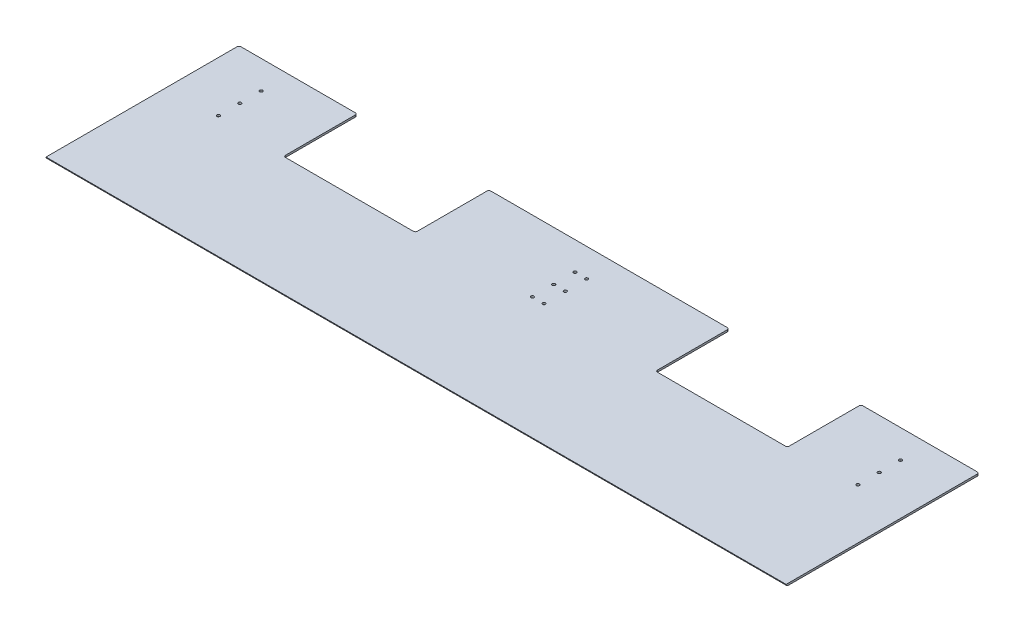
ISO-10303-21;
HEADER;
FILE_DESCRIPTION(('STEP AP214'),'2;1');
FILE_NAME('part.step','',(''),(''),'','','');
FILE_SCHEMA(('AUTOMOTIVE_DESIGN { 1 0 10303 214 1 1 1 1 }'));
ENDSEC;
DATA;
#1=APPLICATION_CONTEXT('core data for automotive mechanical design processes');
#2=APPLICATION_PROTOCOL_DEFINITION('international standard','automotive_design',2000,#1);
#3=PRODUCT_CONTEXT('',#1,'mechanical');
#4=PRODUCT('Part','Part','',(#3));
#5=PRODUCT_RELATED_PRODUCT_CATEGORY('part','',(#4));
#6=PRODUCT_DEFINITION_FORMATION('','',#4);
#7=PRODUCT_DEFINITION_CONTEXT('part definition',#1,'design');
#8=PRODUCT_DEFINITION('design','',#6,#7);
#9=PRODUCT_DEFINITION_SHAPE('','',#8);
#10=(LENGTH_UNIT() NAMED_UNIT(*) SI_UNIT(.MILLI.,.METRE.));
#11=(NAMED_UNIT(*) PLANE_ANGLE_UNIT() SI_UNIT($,.RADIAN.));
#12=(NAMED_UNIT(*) SI_UNIT($,.STERADIAN.) SOLID_ANGLE_UNIT());
#13=UNCERTAINTY_MEASURE_WITH_UNIT(LENGTH_MEASURE(1.E-05),#10,'distance_accuracy_value','');
#14=(GEOMETRIC_REPRESENTATION_CONTEXT(3) GLOBAL_UNCERTAINTY_ASSIGNED_CONTEXT((#13)) GLOBAL_UNIT_ASSIGNED_CONTEXT((#10,
#11,#12)) REPRESENTATION_CONTEXT('',''));
#15=CARTESIAN_POINT('',(0.,0.,0.));
#16=DIRECTION('',(0.,0.,1.));
#17=DIRECTION('',(1.,0.,0.));
#18=AXIS2_PLACEMENT_3D('',#15,#16,#17);
#19=CARTESIAN_POINT('',(0.,3.175,-316.23));
#20=DIRECTION('',(0.,0.,1.));
#21=DIRECTION('',(1.,0.,0.));
#22=AXIS2_PLACEMENT_3D('',#19,#20,#21);
#23=PLANE('',#22);
#24=DIRECTION('',(-1.,0.,0.));
#25=VECTOR('',#24,1.);
#26=CARTESIAN_POINT('',(0.,3.175,-316.23));
#27=LINE('',#26,#25);
#28=CARTESIAN_POINT('',(190.5,3.175,-316.23));
#29=VERTEX_POINT('',#28);
#30=CARTESIAN_POINT('',(3.175,3.175,-316.23));
#31=VERTEX_POINT('',#30);
#32=EDGE_CURVE('E212',#29,#31,#27,.T.);
#33=ORIENTED_EDGE('',*,*,#32,.F.);
#34=DIRECTION('',(0.,1.,0.));
#35=VECTOR('',#34,1.);
#36=CARTESIAN_POINT('',(190.5,3.175,-316.23));
#37=LINE('',#36,#35);
#38=CARTESIAN_POINT('',(190.5,0.,-316.23));
#39=VERTEX_POINT('',#38);
#40=EDGE_CURVE('E55',#29,#39,#37,.F.);
#41=ORIENTED_EDGE('',*,*,#40,.T.);
#42=DIRECTION('',(-1.,0.,0.));
#43=VECTOR('',#42,1.);
#44=CARTESIAN_POINT('',(0.,0.,-316.23));
#45=LINE('',#44,#43);
#46=CARTESIAN_POINT('',(3.175,0.,-316.23));
#47=VERTEX_POINT('',#46);
#48=EDGE_CURVE('E225',#39,#47,#45,.T.);
#49=ORIENTED_EDGE('',*,*,#48,.T.);
#50=DIRECTION('',(0.,-1.,0.));
#51=VECTOR('',#50,1.);
#52=CARTESIAN_POINT('',(3.175,3.175,-316.23));
#53=LINE('',#52,#51);
#54=EDGE_CURVE('E294',#47,#31,#53,.F.);
#55=ORIENTED_EDGE('',*,*,#54,.T.);
#56=EDGE_LOOP('',(#33,#41,#49,#55));
#57=FACE_BOUND('',#56,.T.);
#58=ADVANCED_FACE('F33',(#57),#23,.F.);
#59=CARTESIAN_POINT('',(1209.675,0.,-316.23));
#60=VERTEX_POINT('',#59);
#61=CARTESIAN_POINT('',(1022.35,0.,-316.23));
#62=VERTEX_POINT('',#61);
#63=EDGE_CURVE('E196',#60,#62,#45,.T.);
#64=ORIENTED_EDGE('',*,*,#63,.T.);
#65=DIRECTION('',(0.,1.,0.));
#66=VECTOR('',#65,1.);
#67=CARTESIAN_POINT('',(1022.35,3.175,-316.23));
#68=LINE('',#67,#66);
#69=CARTESIAN_POINT('',(1022.35,3.175,-316.23));
#70=VERTEX_POINT('',#69);
#71=EDGE_CURVE('E284',#62,#70,#68,.T.);
#72=ORIENTED_EDGE('',*,*,#71,.T.);
#73=CARTESIAN_POINT('',(1209.675,3.175,-316.23));
#74=VERTEX_POINT('',#73);
#75=EDGE_CURVE('E216',#74,#70,#27,.T.);
#76=ORIENTED_EDGE('',*,*,#75,.F.);
#77=DIRECTION('',(0.,-1.,0.));
#78=VECTOR('',#77,1.);
#79=CARTESIAN_POINT('',(1209.675,3.175,-316.23));
#80=LINE('',#79,#78);
#81=EDGE_CURVE('E281',#74,#60,#80,.T.);
#82=ORIENTED_EDGE('',*,*,#81,.T.);
#83=EDGE_LOOP('',(#64,#72,#76,#82));
#84=FACE_BOUND('',#83,.T.);
#85=ADVANCED_FACE('F376',(#84),#23,.F.);
#86=CARTESIAN_POINT('',(0.,3.175,0.));
#87=DIRECTION('',(1.,0.,0.));
#88=DIRECTION('',(0.,0.,-1.));
#89=AXIS2_PLACEMENT_3D('',#86,#87,#88);
#90=PLANE('',#89);
#91=DIRECTION('',(0.,0.,1.));
#92=VECTOR('',#91,1.);
#93=CARTESIAN_POINT('',(0.,3.175,0.));
#94=LINE('',#93,#92);
#95=CARTESIAN_POINT('',(0.,3.175,-313.055));
#96=VERTEX_POINT('',#95);
#97=CARTESIAN_POINT('',(0.,3.175,0.));
#98=VERTEX_POINT('',#97);
#99=EDGE_CURVE('E182',#96,#98,#94,.T.);
#100=ORIENTED_EDGE('',*,*,#99,.F.);
#101=DIRECTION('',(0.,-1.,0.));
#102=VECTOR('',#101,1.);
#103=CARTESIAN_POINT('',(0.,3.175,-313.055));
#104=LINE('',#103,#102);
#105=CARTESIAN_POINT('',(0.,0.,-313.055));
#106=VERTEX_POINT('',#105);
#107=EDGE_CURVE('E297',#96,#106,#104,.T.);
#108=ORIENTED_EDGE('',*,*,#107,.T.);
#109=DIRECTION('',(0.,0.,1.));
#110=VECTOR('',#109,1.);
#111=CARTESIAN_POINT('',(0.,0.,0.));
#112=LINE('',#111,#110);
#113=CARTESIAN_POINT('',(0.,0.,-3.175));
#114=VERTEX_POINT('',#113);
#115=EDGE_CURVE('E201',#106,#114,#112,.T.);
#116=ORIENTED_EDGE('',*,*,#115,.T.);
#117=CARTESIAN_POINT('',(0.,3.175,-3.175));
#118=DIRECTION('',(1.,0.,0.));
#119=DIRECTION('',(0.,0.,-1.));
#120=AXIS2_PLACEMENT_3D('',#117,#118,#119);
#121=CIRCLE('',#120,3.175);
#122=EDGE_CURVE('E199',#114,#98,#121,.F.);
#123=ORIENTED_EDGE('',*,*,#122,.T.);
#124=EDGE_LOOP('',(#100,#108,#116,#123));
#125=FACE_BOUND('',#124,.T.);
#126=ADVANCED_FACE('F200',(#125),#90,.F.);
#127=CARTESIAN_POINT('',(1212.85,3.175,0.));
#128=DIRECTION('',(-1.,0.,0.));
#129=DIRECTION('',(0.,0.,1.));
#130=AXIS2_PLACEMENT_3D('',#127,#128,#129);
#131=PLANE('',#130);
#132=DIRECTION('',(0.,0.,-1.));
#133=VECTOR('',#132,1.);
#134=CARTESIAN_POINT('',(1212.85,0.,0.));
#135=LINE('',#134,#133);
#136=CARTESIAN_POINT('',(1212.85,0.,-3.175));
#137=VERTEX_POINT('',#136);
#138=CARTESIAN_POINT('',(1212.85,0.,-313.055));
#139=VERTEX_POINT('',#138);
#140=EDGE_CURVE('E221',#137,#139,#135,.T.);
#141=ORIENTED_EDGE('',*,*,#140,.T.);
#142=DIRECTION('',(0.,-1.,0.));
#143=VECTOR('',#142,1.);
#144=CARTESIAN_POINT('',(1212.85,3.175,-313.055));
#145=LINE('',#144,#143);
#146=CARTESIAN_POINT('',(1212.85,3.175,-313.055));
#147=VERTEX_POINT('',#146);
#148=EDGE_CURVE('E287',#139,#147,#145,.F.);
#149=ORIENTED_EDGE('',*,*,#148,.T.);
#150=DIRECTION('',(0.,0.,-1.));
#151=VECTOR('',#150,1.);
#152=CARTESIAN_POINT('',(1212.85,3.175,0.));
#153=LINE('',#152,#151);
#154=CARTESIAN_POINT('',(1212.85,3.175,0.));
#155=VERTEX_POINT('',#154);
#156=EDGE_CURVE('E210',#155,#147,#153,.T.);
#157=ORIENTED_EDGE('',*,*,#156,.F.);
#158=CARTESIAN_POINT('',(1212.85,3.175,-3.175));
#159=DIRECTION('',(-1.,0.,0.));
#160=DIRECTION('',(0.,0.,1.));
#161=AXIS2_PLACEMENT_3D('',#158,#159,#160);
#162=CIRCLE('',#161,3.175);
#163=EDGE_CURVE('E209',#155,#137,#162,.F.);
#164=ORIENTED_EDGE('',*,*,#163,.T.);
#165=EDGE_LOOP('',(#141,#149,#157,#164));
#166=FACE_BOUND('',#165,.T.);
#167=ADVANCED_FACE('F416',(#166),#131,.F.);
#168=CARTESIAN_POINT('',(800.1,0.,-316.23));
#169=VERTEX_POINT('',#168);
#170=CARTESIAN_POINT('',(412.75,0.,-316.23));
#171=VERTEX_POINT('',#170);
#172=EDGE_CURVE('E227',#169,#171,#45,.T.);
#173=ORIENTED_EDGE('',*,*,#172,.T.);
#174=DIRECTION('',(0.,1.,0.));
#175=VECTOR('',#174,1.);
#176=CARTESIAN_POINT('',(412.75,3.175,-316.23));
#177=LINE('',#176,#175);
#178=CARTESIAN_POINT('',(412.75,3.175,-316.23));
#179=VERTEX_POINT('',#178);
#180=EDGE_CURVE('E241',#171,#179,#177,.T.);
#181=ORIENTED_EDGE('',*,*,#180,.T.);
#182=CARTESIAN_POINT('',(800.1,3.175,-316.23));
#183=VERTEX_POINT('',#182);
#184=EDGE_CURVE('E219',#183,#179,#27,.T.);
#185=ORIENTED_EDGE('',*,*,#184,.F.);
#186=DIRECTION('',(0.,1.,0.));
#187=VECTOR('',#186,1.);
#188=CARTESIAN_POINT('',(800.1,3.175,-316.23));
#189=LINE('',#188,#187);
#190=EDGE_CURVE('E239',#183,#169,#189,.F.);
#191=ORIENTED_EDGE('',*,*,#190,.T.);
#192=EDGE_LOOP('',(#173,#181,#185,#191));
#193=FACE_BOUND('',#192,.T.);
#194=ADVANCED_FACE('F383',(#193),#23,.F.);
#195=CARTESIAN_POINT('',(0.,3.175,0.));
#196=DIRECTION('',(0.,-1.,0.));
#197=DIRECTION('',(0.,0.,-1.));
#198=AXIS2_PLACEMENT_3D('',#195,#196,#197);
#199=PLANE('',#198);
#200=CARTESIAN_POINT('',(82.55,3.175,-200.1012));
#201=DIRECTION('',(0.,1.,0.));
#202=DIRECTION('',(0.,0.,1.));
#203=AXIS2_PLACEMENT_3D('',#200,#201,#202);
#204=CIRCLE('',#203,2.45744999999999);
#205=CARTESIAN_POINT('',(82.55,3.175,-197.64375));
#206=VERTEX_POINT('',#205);
#207=EDGE_CURVE('E506',#206,#206,#204,.T.);
#208=ORIENTED_EDGE('',*,*,#207,.F.);
#209=EDGE_LOOP('',(#208));
#210=FACE_BOUND('',#209,.T.);
#211=CARTESIAN_POINT('',(82.55,3.175,-235.0262));
#212=DIRECTION('',(0.,1.,0.));
#213=DIRECTION('',(0.,0.,1.));
#214=AXIS2_PLACEMENT_3D('',#211,#212,#213);
#215=CIRCLE('',#214,2.45744999999999);
#216=CARTESIAN_POINT('',(82.55,3.175,-232.56875));
#217=VERTEX_POINT('',#216);
#218=EDGE_CURVE('E508',#217,#217,#215,.T.);
#219=ORIENTED_EDGE('',*,*,#218,.F.);
#220=EDGE_LOOP('',(#219));
#221=FACE_BOUND('',#220,.T.);
#222=CARTESIAN_POINT('',(82.55,3.175,-269.9512));
#223=DIRECTION('',(0.,1.,0.));
#224=DIRECTION('',(0.,0.,1.));
#225=AXIS2_PLACEMENT_3D('',#222,#223,#224);
#226=CIRCLE('',#225,2.45744999999999);
#227=CARTESIAN_POINT('',(82.55,3.175,-267.49375));
#228=VERTEX_POINT('',#227);
#229=EDGE_CURVE('E516',#228,#228,#226,.T.);
#230=ORIENTED_EDGE('',*,*,#229,.F.);
#231=EDGE_LOOP('',(#230));
#232=FACE_BOUND('',#231,.T.);
#233=CARTESIAN_POINT('',(596.9,3.175,-200.1012));
#234=DIRECTION('',(0.,1.,0.));
#235=DIRECTION('',(0.,0.,1.));
#236=AXIS2_PLACEMENT_3D('',#233,#234,#235);
#237=CIRCLE('',#236,2.45744999999997);
#238=CARTESIAN_POINT('',(596.9,3.175,-197.64375));
#239=VERTEX_POINT('',#238);
#240=EDGE_CURVE('E522',#239,#239,#237,.T.);
#241=ORIENTED_EDGE('',*,*,#240,.F.);
#242=EDGE_LOOP('',(#241));
#243=FACE_BOUND('',#242,.T.);
#244=CARTESIAN_POINT('',(596.9,3.175,-235.0262));
#245=DIRECTION('',(0.,1.,0.));
#246=DIRECTION('',(0.,0.,1.));
#247=AXIS2_PLACEMENT_3D('',#244,#245,#246);
#248=CIRCLE('',#247,2.45744999999997);
#249=CARTESIAN_POINT('',(596.9,3.175,-232.56875));
#250=VERTEX_POINT('',#249);
#251=EDGE_CURVE('E528',#250,#250,#248,.T.);
#252=ORIENTED_EDGE('',*,*,#251,.F.);
#253=EDGE_LOOP('',(#252));
#254=FACE_BOUND('',#253,.T.);
#255=CARTESIAN_POINT('',(596.9,3.175,-269.9512));
#256=DIRECTION('',(0.,1.,0.));
#257=DIRECTION('',(0.,0.,1.));
#258=AXIS2_PLACEMENT_3D('',#255,#256,#257);
#259=CIRCLE('',#258,2.45744999999997);
#260=CARTESIAN_POINT('',(596.9,3.175,-267.49375));
#261=VERTEX_POINT('',#260);
#262=EDGE_CURVE('E534',#261,#261,#259,.T.);
#263=ORIENTED_EDGE('',*,*,#262,.F.);
#264=EDGE_LOOP('',(#263));
#265=FACE_BOUND('',#264,.T.);
#266=CARTESIAN_POINT('',(615.95,3.175,-269.9512));
#267=DIRECTION('',(0.,1.,0.));
#268=DIRECTION('',(0.,0.,1.));
#269=AXIS2_PLACEMENT_3D('',#266,#267,#268);
#270=CIRCLE('',#269,2.45744999999997);
#271=CARTESIAN_POINT('',(615.95,3.175,-267.49375));
#272=VERTEX_POINT('',#271);
#273=EDGE_CURVE('E540',#272,#272,#270,.T.);
#274=ORIENTED_EDGE('',*,*,#273,.F.);
#275=EDGE_LOOP('',(#274));
#276=FACE_BOUND('',#275,.T.);
#277=CARTESIAN_POINT('',(615.95,3.175,-235.0262));
#278=DIRECTION('',(0.,1.,0.));
#279=DIRECTION('',(0.,0.,1.));
#280=AXIS2_PLACEMENT_3D('',#277,#278,#279);
#281=CIRCLE('',#280,2.45744999999997);
#282=CARTESIAN_POINT('',(615.95,3.175,-232.56875));
#283=VERTEX_POINT('',#282);
#284=EDGE_CURVE('E546',#283,#283,#281,.T.);
#285=ORIENTED_EDGE('',*,*,#284,.F.);
#286=EDGE_LOOP('',(#285));
#287=FACE_BOUND('',#286,.T.);
#288=CARTESIAN_POINT('',(615.95,3.175,-200.1012));
#289=DIRECTION('',(0.,1.,0.));
#290=DIRECTION('',(0.,0.,1.));
#291=AXIS2_PLACEMENT_3D('',#288,#289,#290);
#292=CIRCLE('',#291,2.45744999999997);
#293=CARTESIAN_POINT('',(615.95,3.175,-197.64375));
#294=VERTEX_POINT('',#293);
#295=EDGE_CURVE('E552',#294,#294,#292,.T.);
#296=ORIENTED_EDGE('',*,*,#295,.F.);
#297=EDGE_LOOP('',(#296));
#298=FACE_BOUND('',#297,.T.);
#299=CARTESIAN_POINT('',(1130.3,3.175,-269.9512));
#300=DIRECTION('',(0.,1.,0.));
#301=DIRECTION('',(0.,0.,1.));
#302=AXIS2_PLACEMENT_3D('',#299,#300,#301);
#303=CIRCLE('',#302,2.45745000000008);
#304=CARTESIAN_POINT('',(1130.3,3.175,-267.49375));
#305=VERTEX_POINT('',#304);
#306=EDGE_CURVE('E558',#305,#305,#303,.T.);
#307=ORIENTED_EDGE('',*,*,#306,.F.);
#308=EDGE_LOOP('',(#307));
#309=FACE_BOUND('',#308,.T.);
#310=CARTESIAN_POINT('',(1130.3,3.175,-235.0262));
#311=DIRECTION('',(0.,1.,0.));
#312=DIRECTION('',(0.,0.,1.));
#313=AXIS2_PLACEMENT_3D('',#310,#311,#312);
#314=CIRCLE('',#313,2.45745000000008);
#315=CARTESIAN_POINT('',(1130.3,3.175,-232.56875));
#316=VERTEX_POINT('',#315);
#317=EDGE_CURVE('E564',#316,#316,#314,.T.);
#318=ORIENTED_EDGE('',*,*,#317,.F.);
#319=EDGE_LOOP('',(#318));
#320=FACE_BOUND('',#319,.T.);
#321=CARTESIAN_POINT('',(1130.3,3.175,-200.1012));
#322=DIRECTION('',(0.,1.,0.));
#323=DIRECTION('',(0.,0.,1.));
#324=AXIS2_PLACEMENT_3D('',#321,#322,#323);
#325=CIRCLE('',#324,2.45745000000008);
#326=CARTESIAN_POINT('',(1130.3,3.175,-197.64375));
#327=VERTEX_POINT('',#326);
#328=EDGE_CURVE('E570',#327,#327,#325,.T.);
#329=ORIENTED_EDGE('',*,*,#328,.F.);
#330=EDGE_LOOP('',(#329));
#331=FACE_BOUND('',#330,.T.);
#332=ORIENTED_EDGE('',*,*,#184,.T.);
#333=CARTESIAN_POINT('',(412.75,3.175,-313.055));
#334=DIRECTION('',(0.,-1.,0.));
#335=DIRECTION('',(0.,0.,-1.));
#336=AXIS2_PLACEMENT_3D('',#333,#334,#335);
#337=CIRCLE('',#336,3.175);
#338=CARTESIAN_POINT('',(409.575,3.175,-313.055));
#339=VERTEX_POINT('',#338);
#340=EDGE_CURVE('E253',#179,#339,#337,.F.);
#341=ORIENTED_EDGE('',*,*,#340,.T.);
#342=DIRECTION('',(0.,0.,-1.));
#343=VECTOR('',#342,1.);
#344=CARTESIAN_POINT('',(409.575,3.175,-316.23));
#345=LINE('',#344,#343);
#346=CARTESIAN_POINT('',(409.575,3.175,-198.755));
#347=VERTEX_POINT('',#346);
#348=EDGE_CURVE('E340',#347,#339,#345,.T.);
#349=ORIENTED_EDGE('',*,*,#348,.F.);
#350=CARTESIAN_POINT('',(406.4,3.175,-198.755));
#351=DIRECTION('',(0.,-1.,0.));
#352=DIRECTION('',(0.,0.,-1.));
#353=AXIS2_PLACEMENT_3D('',#350,#351,#352);
#354=CIRCLE('',#353,3.175);
#355=CARTESIAN_POINT('',(406.4,3.175,-195.58));
#356=VERTEX_POINT('',#355);
#357=EDGE_CURVE('E299',#347,#356,#354,.T.);
#358=ORIENTED_EDGE('',*,*,#357,.T.);
#359=DIRECTION('',(1.,0.,0.));
#360=VECTOR('',#359,1.);
#361=CARTESIAN_POINT('',(193.675,3.175,-195.58));
#362=LINE('',#361,#360);
#363=CARTESIAN_POINT('',(196.85,3.175,-195.58));
#364=VERTEX_POINT('',#363);
#365=EDGE_CURVE('E315',#364,#356,#362,.T.);
#366=ORIENTED_EDGE('',*,*,#365,.F.);
#367=CARTESIAN_POINT('',(196.85,3.175,-198.755));
#368=DIRECTION('',(0.,-1.,0.));
#369=DIRECTION('',(0.,0.,-1.));
#370=AXIS2_PLACEMENT_3D('',#367,#368,#369);
#371=CIRCLE('',#370,3.175);
#372=CARTESIAN_POINT('',(193.675,3.175,-198.755));
#373=VERTEX_POINT('',#372);
#374=EDGE_CURVE('E41',#364,#373,#371,.T.);
#375=ORIENTED_EDGE('',*,*,#374,.T.);
#376=DIRECTION('',(0.,0.,1.));
#377=VECTOR('',#376,1.);
#378=CARTESIAN_POINT('',(193.675,3.175,-316.23));
#379=LINE('',#378,#377);
#380=CARTESIAN_POINT('',(193.675,3.175,-313.055));
#381=VERTEX_POINT('',#380);
#382=EDGE_CURVE('E313',#381,#373,#379,.T.);
#383=ORIENTED_EDGE('',*,*,#382,.F.);
#384=CARTESIAN_POINT('',(190.5,3.175,-313.055));
#385=DIRECTION('',(0.,-1.,0.));
#386=DIRECTION('',(0.,0.,-1.));
#387=AXIS2_PLACEMENT_3D('',#384,#385,#386);
#388=CIRCLE('',#387,3.175);
#389=EDGE_CURVE('E245',#381,#29,#388,.F.);
#390=ORIENTED_EDGE('',*,*,#389,.T.);
#391=ORIENTED_EDGE('',*,*,#32,.T.);
#392=CARTESIAN_POINT('',(3.175,3.175,-313.055));
#393=DIRECTION('',(0.,-1.,0.));
#394=DIRECTION('',(0.,0.,-1.));
#395=AXIS2_PLACEMENT_3D('',#392,#393,#394);
#396=CIRCLE('',#395,3.175);
#397=EDGE_CURVE('E192',#31,#96,#396,.F.);
#398=ORIENTED_EDGE('',*,*,#397,.T.);
#399=ORIENTED_EDGE('',*,*,#99,.T.);
#400=DIRECTION('',(1.,0.,0.));
#401=VECTOR('',#400,1.);
#402=CARTESIAN_POINT('',(0.,3.175,0.));
#403=LINE('',#402,#401);
#404=EDGE_CURVE('E188',#98,#155,#403,.T.);
#405=ORIENTED_EDGE('',*,*,#404,.T.);
#406=ORIENTED_EDGE('',*,*,#156,.T.);
#407=CARTESIAN_POINT('',(1209.675,3.175,-313.055));
#408=DIRECTION('',(0.,-1.,0.));
#409=DIRECTION('',(0.,0.,-1.));
#410=AXIS2_PLACEMENT_3D('',#407,#408,#409);
#411=CIRCLE('',#410,3.175);
#412=EDGE_CURVE('E247',#147,#74,#411,.F.);
#413=ORIENTED_EDGE('',*,*,#412,.T.);
#414=ORIENTED_EDGE('',*,*,#75,.T.);
#415=CARTESIAN_POINT('',(1022.35,3.175,-313.055));
#416=DIRECTION('',(0.,-1.,0.));
#417=DIRECTION('',(0.,0.,-1.));
#418=AXIS2_PLACEMENT_3D('',#415,#416,#417);
#419=CIRCLE('',#418,3.175);
#420=CARTESIAN_POINT('',(1019.175,3.175,-313.055));
#421=VERTEX_POINT('',#420);
#422=EDGE_CURVE('E249',#70,#421,#419,.F.);
#423=ORIENTED_EDGE('',*,*,#422,.T.);
#424=DIRECTION('',(0.,0.,-1.));
#425=VECTOR('',#424,1.);
#426=CARTESIAN_POINT('',(1019.175,3.175,-316.23));
#427=LINE('',#426,#425);
#428=CARTESIAN_POINT('',(1019.175,3.175,-198.755));
#429=VERTEX_POINT('',#428);
#430=EDGE_CURVE('E351',#429,#421,#427,.T.);
#431=ORIENTED_EDGE('',*,*,#430,.F.);
#432=CARTESIAN_POINT('',(1016.,3.175,-198.755));
#433=DIRECTION('',(0.,-1.,0.));
#434=DIRECTION('',(0.,0.,-1.));
#435=AXIS2_PLACEMENT_3D('',#432,#433,#434);
#436=CIRCLE('',#435,3.175);
#437=CARTESIAN_POINT('',(1016.,3.175,-195.58));
#438=VERTEX_POINT('',#437);
#439=EDGE_CURVE('E307',#429,#438,#436,.T.);
#440=ORIENTED_EDGE('',*,*,#439,.T.);
#441=DIRECTION('',(1.,0.,0.));
#442=VECTOR('',#441,1.);
#443=CARTESIAN_POINT('',(1019.175,3.175,-195.58));
#444=LINE('',#443,#442);
#445=CARTESIAN_POINT('',(806.45,3.175,-195.58));
#446=VERTEX_POINT('',#445);
#447=EDGE_CURVE('E359',#446,#438,#444,.T.);
#448=ORIENTED_EDGE('',*,*,#447,.F.);
#449=CARTESIAN_POINT('',(806.45,3.175,-198.755));
#450=DIRECTION('',(0.,-1.,0.));
#451=DIRECTION('',(0.,0.,-1.));
#452=AXIS2_PLACEMENT_3D('',#449,#450,#451);
#453=CIRCLE('',#452,3.175);
#454=CARTESIAN_POINT('',(803.275,3.175,-198.755));
#455=VERTEX_POINT('',#454);
#456=EDGE_CURVE('E303',#446,#455,#453,.T.);
#457=ORIENTED_EDGE('',*,*,#456,.T.);
#458=DIRECTION('',(0.,0.,1.));
#459=VECTOR('',#458,1.);
#460=CARTESIAN_POINT('',(803.275,3.175,-316.23));
#461=LINE('',#460,#459);
#462=CARTESIAN_POINT('',(803.275,3.175,-313.055));
#463=VERTEX_POINT('',#462);
#464=EDGE_CURVE('E356',#463,#455,#461,.T.);
#465=ORIENTED_EDGE('',*,*,#464,.F.);
#466=CARTESIAN_POINT('',(800.1,3.175,-313.055));
#467=DIRECTION('',(0.,-1.,0.));
#468=DIRECTION('',(0.,0.,-1.));
#469=AXIS2_PLACEMENT_3D('',#466,#467,#468);
#470=CIRCLE('',#469,3.175);
#471=EDGE_CURVE('E251',#463,#183,#470,.F.);
#472=ORIENTED_EDGE('',*,*,#471,.T.);
#473=EDGE_LOOP('',(#332,#341,#349,#358,#366,#375,#383,#390,#391,#398,#399,#405,#406,#413,#414,
#423,#431,#440,#448,#457,#465,#472));
#474=FACE_BOUND('',#473,.T.);
#475=ADVANCED_FACE('F185',(#210,#221,#232,#243,#254,#265,#276,#287,#298,#309,#320,#331,#474),
#199,.F.);
#476=CARTESIAN_POINT('',(0.,0.,0.));
#477=DIRECTION('',(0.,-1.,0.));
#478=DIRECTION('',(0.,0.,-1.));
#479=AXIS2_PLACEMENT_3D('',#476,#477,#478);
#480=PLANE('',#479);
#481=CARTESIAN_POINT('',(82.55,0.,-200.1012));
#482=DIRECTION('',(0.,1.,0.));
#483=DIRECTION('',(0.,0.,1.));
#484=AXIS2_PLACEMENT_3D('',#481,#482,#483);
#485=CIRCLE('',#484,2.45745);
#486=CARTESIAN_POINT('',(82.55,0.,-197.64375));
#487=VERTEX_POINT('',#486);
#488=EDGE_CURVE('E503',#487,#487,#485,.T.);
#489=ORIENTED_EDGE('',*,*,#488,.T.);
#490=EDGE_LOOP('',(#489));
#491=FACE_BOUND('',#490,.T.);
#492=CARTESIAN_POINT('',(82.55,0.,-235.0262));
#493=DIRECTION('',(0.,1.,0.));
#494=DIRECTION('',(0.,0.,1.));
#495=AXIS2_PLACEMENT_3D('',#492,#493,#494);
#496=CIRCLE('',#495,2.45745);
#497=CARTESIAN_POINT('',(82.55,0.,-232.56875));
#498=VERTEX_POINT('',#497);
#499=EDGE_CURVE('E513',#498,#498,#496,.T.);
#500=ORIENTED_EDGE('',*,*,#499,.T.);
#501=EDGE_LOOP('',(#500));
#502=FACE_BOUND('',#501,.T.);
#503=CARTESIAN_POINT('',(82.55,0.,-269.9512));
#504=DIRECTION('',(0.,1.,0.));
#505=DIRECTION('',(0.,0.,1.));
#506=AXIS2_PLACEMENT_3D('',#503,#504,#505);
#507=CIRCLE('',#506,2.45745);
#508=CARTESIAN_POINT('',(82.55,0.,-267.49375));
#509=VERTEX_POINT('',#508);
#510=EDGE_CURVE('E519',#509,#509,#507,.T.);
#511=ORIENTED_EDGE('',*,*,#510,.T.);
#512=EDGE_LOOP('',(#511));
#513=FACE_BOUND('',#512,.T.);
#514=CARTESIAN_POINT('',(596.9,0.,-200.1012));
#515=DIRECTION('',(0.,1.,0.));
#516=DIRECTION('',(0.,0.,1.));
#517=AXIS2_PLACEMENT_3D('',#514,#515,#516);
#518=CIRCLE('',#517,2.45744999999997);
#519=CARTESIAN_POINT('',(596.9,0.,-197.64375));
#520=VERTEX_POINT('',#519);
#521=EDGE_CURVE('E525',#520,#520,#518,.T.);
#522=ORIENTED_EDGE('',*,*,#521,.T.);
#523=EDGE_LOOP('',(#522));
#524=FACE_BOUND('',#523,.T.);
#525=CARTESIAN_POINT('',(596.9,0.,-235.0262));
#526=DIRECTION('',(0.,1.,0.));
#527=DIRECTION('',(0.,0.,1.));
#528=AXIS2_PLACEMENT_3D('',#525,#526,#527);
#529=CIRCLE('',#528,2.45744999999997);
#530=CARTESIAN_POINT('',(596.9,0.,-232.56875));
#531=VERTEX_POINT('',#530);
#532=EDGE_CURVE('E531',#531,#531,#529,.T.);
#533=ORIENTED_EDGE('',*,*,#532,.T.);
#534=EDGE_LOOP('',(#533));
#535=FACE_BOUND('',#534,.T.);
#536=CARTESIAN_POINT('',(596.9,0.,-269.9512));
#537=DIRECTION('',(0.,1.,0.));
#538=DIRECTION('',(0.,0.,1.));
#539=AXIS2_PLACEMENT_3D('',#536,#537,#538);
#540=CIRCLE('',#539,2.45744999999997);
#541=CARTESIAN_POINT('',(596.9,0.,-267.49375));
#542=VERTEX_POINT('',#541);
#543=EDGE_CURVE('E537',#542,#542,#540,.T.);
#544=ORIENTED_EDGE('',*,*,#543,.T.);
#545=EDGE_LOOP('',(#544));
#546=FACE_BOUND('',#545,.T.);
#547=CARTESIAN_POINT('',(615.95,0.,-269.9512));
#548=DIRECTION('',(0.,1.,0.));
#549=DIRECTION('',(0.,0.,1.));
#550=AXIS2_PLACEMENT_3D('',#547,#548,#549);
#551=CIRCLE('',#550,2.45744999999997);
#552=CARTESIAN_POINT('',(615.95,0.,-267.49375));
#553=VERTEX_POINT('',#552);
#554=EDGE_CURVE('E543',#553,#553,#551,.T.);
#555=ORIENTED_EDGE('',*,*,#554,.T.);
#556=EDGE_LOOP('',(#555));
#557=FACE_BOUND('',#556,.T.);
#558=CARTESIAN_POINT('',(615.95,0.,-235.0262));
#559=DIRECTION('',(0.,1.,0.));
#560=DIRECTION('',(0.,0.,1.));
#561=AXIS2_PLACEMENT_3D('',#558,#559,#560);
#562=CIRCLE('',#561,2.45744999999997);
#563=CARTESIAN_POINT('',(615.95,0.,-232.56875));
#564=VERTEX_POINT('',#563);
#565=EDGE_CURVE('E549',#564,#564,#562,.T.);
#566=ORIENTED_EDGE('',*,*,#565,.T.);
#567=EDGE_LOOP('',(#566));
#568=FACE_BOUND('',#567,.T.);
#569=CARTESIAN_POINT('',(615.95,0.,-200.1012));
#570=DIRECTION('',(0.,1.,0.));
#571=DIRECTION('',(0.,0.,1.));
#572=AXIS2_PLACEMENT_3D('',#569,#570,#571);
#573=CIRCLE('',#572,2.45744999999997);
#574=CARTESIAN_POINT('',(615.95,0.,-197.64375));
#575=VERTEX_POINT('',#574);
#576=EDGE_CURVE('E555',#575,#575,#573,.T.);
#577=ORIENTED_EDGE('',*,*,#576,.T.);
#578=EDGE_LOOP('',(#577));
#579=FACE_BOUND('',#578,.T.);
#580=CARTESIAN_POINT('',(1130.3,0.,-269.9512));
#581=DIRECTION('',(0.,1.,0.));
#582=DIRECTION('',(0.,0.,1.));
#583=AXIS2_PLACEMENT_3D('',#580,#581,#582);
#584=CIRCLE('',#583,2.45745000000008);
#585=CARTESIAN_POINT('',(1130.3,0.,-267.49375));
#586=VERTEX_POINT('',#585);
#587=EDGE_CURVE('E561',#586,#586,#584,.T.);
#588=ORIENTED_EDGE('',*,*,#587,.T.);
#589=EDGE_LOOP('',(#588));
#590=FACE_BOUND('',#589,.T.);
#591=CARTESIAN_POINT('',(1130.3,0.,-235.0262));
#592=DIRECTION('',(0.,1.,0.));
#593=DIRECTION('',(0.,0.,1.));
#594=AXIS2_PLACEMENT_3D('',#591,#592,#593);
#595=CIRCLE('',#594,2.45745000000008);
#596=CARTESIAN_POINT('',(1130.3,0.,-232.56875));
#597=VERTEX_POINT('',#596);
#598=EDGE_CURVE('E567',#597,#597,#595,.T.);
#599=ORIENTED_EDGE('',*,*,#598,.T.);
#600=EDGE_LOOP('',(#599));
#601=FACE_BOUND('',#600,.T.);
#602=CARTESIAN_POINT('',(1130.3,0.,-200.1012));
#603=DIRECTION('',(0.,1.,0.));
#604=DIRECTION('',(0.,0.,1.));
#605=AXIS2_PLACEMENT_3D('',#602,#603,#604);
#606=CIRCLE('',#605,2.45745000000008);
#607=CARTESIAN_POINT('',(1130.3,0.,-197.64375));
#608=VERTEX_POINT('',#607);
#609=EDGE_CURVE('E360',#608,#608,#606,.T.);
#610=ORIENTED_EDGE('',*,*,#609,.T.);
#611=EDGE_LOOP('',(#610));
#612=FACE_BOUND('',#611,.T.);
#613=DIRECTION('',(0.,0.,-1.));
#614=VECTOR('',#613,1.);
#615=CARTESIAN_POINT('',(409.575,0.,-316.23));
#616=LINE('',#615,#614);
#617=CARTESIAN_POINT('',(409.575,0.,-198.755));
#618=VERTEX_POINT('',#617);
#619=CARTESIAN_POINT('',(409.575,0.,-313.055));
#620=VERTEX_POINT('',#619);
#621=EDGE_CURVE('E222',#618,#620,#616,.T.);
#622=ORIENTED_EDGE('',*,*,#621,.T.);
#623=CARTESIAN_POINT('',(412.75,0.,-313.055));
#624=DIRECTION('',(0.,-1.,0.));
#625=DIRECTION('',(0.,0.,-1.));
#626=AXIS2_PLACEMENT_3D('',#623,#624,#625);
#627=CIRCLE('',#626,3.175);
#628=EDGE_CURVE('E264',#620,#171,#627,.T.);
#629=ORIENTED_EDGE('',*,*,#628,.T.);
#630=ORIENTED_EDGE('',*,*,#172,.F.);
#631=CARTESIAN_POINT('',(800.1,0.,-313.055));
#632=DIRECTION('',(0.,-1.,0.));
#633=DIRECTION('',(0.,0.,-1.));
#634=AXIS2_PLACEMENT_3D('',#631,#632,#633);
#635=CIRCLE('',#634,3.175);
#636=CARTESIAN_POINT('',(803.275,0.,-313.055));
#637=VERTEX_POINT('',#636);
#638=EDGE_CURVE('E262',#169,#637,#635,.T.);
#639=ORIENTED_EDGE('',*,*,#638,.T.);
#640=DIRECTION('',(0.,0.,1.));
#641=VECTOR('',#640,1.);
#642=CARTESIAN_POINT('',(803.275,0.,-316.23));
#643=LINE('',#642,#641);
#644=CARTESIAN_POINT('',(803.275,0.,-198.755));
#645=VERTEX_POINT('',#644);
#646=EDGE_CURVE('E347',#637,#645,#643,.T.);
#647=ORIENTED_EDGE('',*,*,#646,.T.);
#648=CARTESIAN_POINT('',(806.45,0.,-198.755));
#649=DIRECTION('',(0.,-1.,0.));
#650=DIRECTION('',(0.,0.,-1.));
#651=AXIS2_PLACEMENT_3D('',#648,#649,#650);
#652=CIRCLE('',#651,3.175);
#653=CARTESIAN_POINT('',(806.45,0.,-195.58));
#654=VERTEX_POINT('',#653);
#655=EDGE_CURVE('E305',#645,#654,#652,.F.);
#656=ORIENTED_EDGE('',*,*,#655,.T.);
#657=DIRECTION('',(1.,0.,0.));
#658=VECTOR('',#657,1.);
#659=CARTESIAN_POINT('',(1019.175,0.,-195.58));
#660=LINE('',#659,#658);
#661=CARTESIAN_POINT('',(1016.,0.,-195.58));
#662=VERTEX_POINT('',#661);
#663=EDGE_CURVE('E350',#654,#662,#660,.T.);
#664=ORIENTED_EDGE('',*,*,#663,.T.);
#665=CARTESIAN_POINT('',(1016.,0.,-198.755));
#666=DIRECTION('',(0.,-1.,0.));
#667=DIRECTION('',(0.,0.,-1.));
#668=AXIS2_PLACEMENT_3D('',#665,#666,#667);
#669=CIRCLE('',#668,3.175);
#670=CARTESIAN_POINT('',(1019.175,0.,-198.755));
#671=VERTEX_POINT('',#670);
#672=EDGE_CURVE('E309',#662,#671,#669,.F.);
#673=ORIENTED_EDGE('',*,*,#672,.T.);
#674=DIRECTION('',(0.,0.,-1.));
#675=VECTOR('',#674,1.);
#676=CARTESIAN_POINT('',(1019.175,0.,-316.23));
#677=LINE('',#676,#675);
#678=CARTESIAN_POINT('',(1019.175,0.,-313.055));
#679=VERTEX_POINT('',#678);
#680=EDGE_CURVE('E324',#671,#679,#677,.T.);
#681=ORIENTED_EDGE('',*,*,#680,.T.);
#682=CARTESIAN_POINT('',(1022.35,0.,-313.055));
#683=DIRECTION('',(0.,-1.,0.));
#684=DIRECTION('',(0.,0.,-1.));
#685=AXIS2_PLACEMENT_3D('',#682,#683,#684);
#686=CIRCLE('',#685,3.175);
#687=EDGE_CURVE('E260',#679,#62,#686,.T.);
#688=ORIENTED_EDGE('',*,*,#687,.T.);
#689=ORIENTED_EDGE('',*,*,#63,.F.);
#690=CARTESIAN_POINT('',(1209.675,0.,-313.055));
#691=DIRECTION('',(0.,-1.,0.));
#692=DIRECTION('',(0.,0.,-1.));
#693=AXIS2_PLACEMENT_3D('',#690,#691,#692);
#694=CIRCLE('',#693,3.175);
#695=EDGE_CURVE('E258',#60,#139,#694,.T.);
#696=ORIENTED_EDGE('',*,*,#695,.T.);
#697=ORIENTED_EDGE('',*,*,#140,.F.);
#698=DIRECTION('',(1.,0.,0.));
#699=VECTOR('',#698,1.);
#700=CARTESIAN_POINT('',(0.,0.,-3.175));
#701=LINE('',#700,#699);
#702=EDGE_CURVE('E206',#137,#114,#701,.F.);
#703=ORIENTED_EDGE('',*,*,#702,.T.);
#704=ORIENTED_EDGE('',*,*,#115,.F.);
#705=CARTESIAN_POINT('',(3.175,0.,-313.055));
#706=DIRECTION('',(0.,-1.,0.));
#707=DIRECTION('',(0.,0.,-1.));
#708=AXIS2_PLACEMENT_3D('',#705,#706,#707);
#709=CIRCLE('',#708,3.175);
#710=EDGE_CURVE('E48',#106,#47,#709,.T.);
#711=ORIENTED_EDGE('',*,*,#710,.T.);
#712=ORIENTED_EDGE('',*,*,#48,.F.);
#713=CARTESIAN_POINT('',(190.5,0.,-313.055));
#714=DIRECTION('',(0.,-1.,0.));
#715=DIRECTION('',(0.,0.,-1.));
#716=AXIS2_PLACEMENT_3D('',#713,#714,#715);
#717=CIRCLE('',#716,3.175);
#718=CARTESIAN_POINT('',(193.675,0.,-313.055));
#719=VERTEX_POINT('',#718);
#720=EDGE_CURVE('E256',#39,#719,#717,.T.);
#721=ORIENTED_EDGE('',*,*,#720,.T.);
#722=DIRECTION('',(0.,0.,1.));
#723=VECTOR('',#722,1.);
#724=CARTESIAN_POINT('',(193.675,0.,-316.23));
#725=LINE('',#724,#723);
#726=CARTESIAN_POINT('',(193.675,0.,-198.755));
#727=VERTEX_POINT('',#726);
#728=EDGE_CURVE('E334',#719,#727,#725,.T.);
#729=ORIENTED_EDGE('',*,*,#728,.T.);
#730=CARTESIAN_POINT('',(196.85,0.,-198.755));
#731=DIRECTION('',(0.,-1.,0.));
#732=DIRECTION('',(0.,0.,-1.));
#733=AXIS2_PLACEMENT_3D('',#730,#731,#732);
#734=CIRCLE('',#733,3.175);
#735=CARTESIAN_POINT('',(196.85,0.,-195.58));
#736=VERTEX_POINT('',#735);
#737=EDGE_CURVE('E11',#727,#736,#734,.F.);
#738=ORIENTED_EDGE('',*,*,#737,.T.);
#739=DIRECTION('',(1.,0.,0.));
#740=VECTOR('',#739,1.);
#741=CARTESIAN_POINT('',(193.675,0.,-195.58));
#742=LINE('',#741,#740);
#743=CARTESIAN_POINT('',(406.4,0.,-195.58));
#744=VERTEX_POINT('',#743);
#745=EDGE_CURVE('E332',#736,#744,#742,.T.);
#746=ORIENTED_EDGE('',*,*,#745,.T.);
#747=CARTESIAN_POINT('',(406.4,0.,-198.755));
#748=DIRECTION('',(0.,-1.,0.));
#749=DIRECTION('',(0.,0.,-1.));
#750=AXIS2_PLACEMENT_3D('',#747,#748,#749);
#751=CIRCLE('',#750,3.175);
#752=EDGE_CURVE('E301',#744,#618,#751,.F.);
#753=ORIENTED_EDGE('',*,*,#752,.T.);
#754=EDGE_LOOP('',(#622,#629,#630,#639,#647,#656,#664,#673,#681,#688,#689,#696,#697,#703,#704,
#711,#712,#721,#729,#738,#746,#753));
#755=FACE_BOUND('',#754,.T.);
#756=ADVANCED_FACE('F331',(#491,#502,#513,#524,#535,#546,#557,#568,#579,#590,#601,#612,#755),
#480,.T.);
#757=CARTESIAN_POINT('',(0.,3.175,-3.175));
#758=DIRECTION('',(-1.,0.,0.));
#759=DIRECTION('',(0.,0.,1.));
#760=AXIS2_PLACEMENT_3D('',#757,#758,#759);
#761=CYLINDRICAL_SURFACE('',#760,3.175);
#762=ORIENTED_EDGE('',*,*,#122,.F.);
#763=ORIENTED_EDGE('',*,*,#702,.F.);
#764=ORIENTED_EDGE('',*,*,#163,.F.);
#765=ORIENTED_EDGE('',*,*,#404,.F.);
#766=EDGE_LOOP('',(#762,#763,#764,#765));
#767=FACE_BOUND('',#766,.T.);
#768=ADVANCED_FACE('F208',(#767),#761,.T.);
#769=CARTESIAN_POINT('',(1019.175,0.,-316.23));
#770=DIRECTION('',(1.,0.,0.));
#771=DIRECTION('',(0.,0.,-1.));
#772=AXIS2_PLACEMENT_3D('',#769,#770,#771);
#773=PLANE('',#772);
#774=ORIENTED_EDGE('',*,*,#680,.F.);
#775=DIRECTION('',(0.,1.,0.));
#776=VECTOR('',#775,1.);
#777=CARTESIAN_POINT('',(1019.175,3.175,-198.755));
#778=LINE('',#777,#776);
#779=EDGE_CURVE('E278',#671,#429,#778,.T.);
#780=ORIENTED_EDGE('',*,*,#779,.T.);
#781=ORIENTED_EDGE('',*,*,#430,.T.);
#782=DIRECTION('',(0.,1.,0.));
#783=VECTOR('',#782,1.);
#784=CARTESIAN_POINT('',(1019.175,0.,-313.055));
#785=LINE('',#784,#783);
#786=EDGE_CURVE('E276',#421,#679,#785,.F.);
#787=ORIENTED_EDGE('',*,*,#786,.T.);
#788=EDGE_LOOP('',(#774,#780,#781,#787));
#789=FACE_BOUND('',#788,.T.);
#790=ADVANCED_FACE('F367',(#789),#773,.F.);
#791=CARTESIAN_POINT('',(1019.175,0.,-195.58));
#792=DIRECTION('',(0.,0.,1.));
#793=DIRECTION('',(1.,0.,0.));
#794=AXIS2_PLACEMENT_3D('',#791,#792,#793);
#795=PLANE('',#794);
#796=ORIENTED_EDGE('',*,*,#663,.F.);
#797=DIRECTION('',(0.,1.,0.));
#798=VECTOR('',#797,1.);
#799=CARTESIAN_POINT('',(806.45,3.175,-195.58));
#800=LINE('',#799,#798);
#801=EDGE_CURVE('E273',#654,#446,#800,.T.);
#802=ORIENTED_EDGE('',*,*,#801,.T.);
#803=ORIENTED_EDGE('',*,*,#447,.T.);
#804=DIRECTION('',(0.,1.,0.));
#805=VECTOR('',#804,1.);
#806=CARTESIAN_POINT('',(1016.,0.,-195.58));
#807=LINE('',#806,#805);
#808=EDGE_CURVE('E271',#438,#662,#807,.F.);
#809=ORIENTED_EDGE('',*,*,#808,.T.);
#810=EDGE_LOOP('',(#796,#802,#803,#809));
#811=FACE_BOUND('',#810,.T.);
#812=ADVANCED_FACE('F433',(#811),#795,.F.);
#813=CARTESIAN_POINT('',(803.275,0.,-316.23));
#814=DIRECTION('',(-1.,0.,0.));
#815=DIRECTION('',(0.,0.,1.));
#816=AXIS2_PLACEMENT_3D('',#813,#814,#815);
#817=PLANE('',#816);
#818=ORIENTED_EDGE('',*,*,#646,.F.);
#819=DIRECTION('',(0.,1.,0.));
#820=VECTOR('',#819,1.);
#821=CARTESIAN_POINT('',(803.275,0.,-313.055));
#822=LINE('',#821,#820);
#823=EDGE_CURVE('E268',#637,#463,#822,.T.);
#824=ORIENTED_EDGE('',*,*,#823,.T.);
#825=ORIENTED_EDGE('',*,*,#464,.T.);
#826=DIRECTION('',(0.,1.,0.));
#827=VECTOR('',#826,1.);
#828=CARTESIAN_POINT('',(803.275,0.,-198.755));
#829=LINE('',#828,#827);
#830=EDGE_CURVE('E266',#455,#645,#829,.F.);
#831=ORIENTED_EDGE('',*,*,#830,.T.);
#832=EDGE_LOOP('',(#818,#824,#825,#831));
#833=FACE_BOUND('',#832,.T.);
#834=ADVANCED_FACE('F441',(#833),#817,.F.);
#835=CARTESIAN_POINT('',(193.675,0.,-316.23));
#836=DIRECTION('',(-1.,0.,0.));
#837=DIRECTION('',(0.,0.,1.));
#838=AXIS2_PLACEMENT_3D('',#835,#836,#837);
#839=PLANE('',#838);
#840=ORIENTED_EDGE('',*,*,#728,.F.);
#841=DIRECTION('',(0.,1.,0.));
#842=VECTOR('',#841,1.);
#843=CARTESIAN_POINT('',(193.675,0.,-313.055));
#844=LINE('',#843,#842);
#845=EDGE_CURVE('E291',#719,#381,#844,.T.);
#846=ORIENTED_EDGE('',*,*,#845,.T.);
#847=ORIENTED_EDGE('',*,*,#382,.T.);
#848=DIRECTION('',(0.,1.,0.));
#849=VECTOR('',#848,1.);
#850=CARTESIAN_POINT('',(193.675,0.,-198.755));
#851=LINE('',#850,#849);
#852=EDGE_CURVE('E289',#373,#727,#851,.F.);
#853=ORIENTED_EDGE('',*,*,#852,.T.);
#854=EDGE_LOOP('',(#840,#846,#847,#853));
#855=FACE_BOUND('',#854,.T.);
#856=ADVANCED_FACE('F321',(#855),#839,.F.);
#857=CARTESIAN_POINT('',(409.575,0.,-316.23));
#858=DIRECTION('',(1.,0.,0.));
#859=DIRECTION('',(0.,0.,-1.));
#860=AXIS2_PLACEMENT_3D('',#857,#858,#859);
#861=PLANE('',#860);
#862=ORIENTED_EDGE('',*,*,#621,.F.);
#863=DIRECTION('',(0.,1.,0.));
#864=VECTOR('',#863,1.);
#865=CARTESIAN_POINT('',(409.575,3.175,-198.755));
#866=LINE('',#865,#864);
#867=EDGE_CURVE('E231',#618,#347,#866,.T.);
#868=ORIENTED_EDGE('',*,*,#867,.T.);
#869=ORIENTED_EDGE('',*,*,#348,.T.);
#870=DIRECTION('',(0.,1.,0.));
#871=VECTOR('',#870,1.);
#872=CARTESIAN_POINT('',(409.575,0.,-313.055));
#873=LINE('',#872,#871);
#874=EDGE_CURVE('E205',#339,#620,#873,.F.);
#875=ORIENTED_EDGE('',*,*,#874,.T.);
#876=EDGE_LOOP('',(#862,#868,#869,#875));
#877=FACE_BOUND('',#876,.T.);
#878=ADVANCED_FACE('F394',(#877),#861,.F.);
#879=CARTESIAN_POINT('',(193.675,0.,-195.58));
#880=DIRECTION('',(0.,0.,1.));
#881=DIRECTION('',(1.,0.,0.));
#882=AXIS2_PLACEMENT_3D('',#879,#880,#881);
#883=PLANE('',#882);
#884=ORIENTED_EDGE('',*,*,#365,.T.);
#885=DIRECTION('',(0.,1.,0.));
#886=VECTOR('',#885,1.);
#887=CARTESIAN_POINT('',(406.4,0.,-195.58));
#888=LINE('',#887,#886);
#889=EDGE_CURVE('E237',#356,#744,#888,.F.);
#890=ORIENTED_EDGE('',*,*,#889,.T.);
#891=ORIENTED_EDGE('',*,*,#745,.F.);
#892=DIRECTION('',(0.,1.,0.));
#893=VECTOR('',#892,1.);
#894=CARTESIAN_POINT('',(196.85,3.175,-195.58));
#895=LINE('',#894,#893);
#896=EDGE_CURVE('E234',#736,#364,#895,.T.);
#897=ORIENTED_EDGE('',*,*,#896,.T.);
#898=EDGE_LOOP('',(#884,#890,#891,#897));
#899=FACE_BOUND('',#898,.T.);
#900=ADVANCED_FACE('F336',(#899),#883,.F.);
#901=CARTESIAN_POINT('',(406.4,0.,-198.755));
#902=DIRECTION('',(0.,-1.,0.));
#903=DIRECTION('',(0.,0.,-1.));
#904=AXIS2_PLACEMENT_3D('',#901,#902,#903);
#905=CYLINDRICAL_SURFACE('',#904,3.175);
#906=ORIENTED_EDGE('',*,*,#752,.F.);
#907=ORIENTED_EDGE('',*,*,#889,.F.);
#908=ORIENTED_EDGE('',*,*,#357,.F.);
#909=ORIENTED_EDGE('',*,*,#867,.F.);
#910=EDGE_LOOP('',(#906,#907,#908,#909));
#911=FACE_BOUND('',#910,.T.);
#912=ADVANCED_FACE('F397',(#911),#905,.F.);
#913=CARTESIAN_POINT('',(412.75,3.175,-313.055));
#914=DIRECTION('',(0.,1.,0.));
#915=DIRECTION('',(0.,0.,1.));
#916=AXIS2_PLACEMENT_3D('',#913,#914,#915);
#917=CYLINDRICAL_SURFACE('',#916,3.175);
#918=ORIENTED_EDGE('',*,*,#628,.F.);
#919=ORIENTED_EDGE('',*,*,#874,.F.);
#920=ORIENTED_EDGE('',*,*,#340,.F.);
#921=ORIENTED_EDGE('',*,*,#180,.F.);
#922=EDGE_LOOP('',(#918,#919,#920,#921));
#923=FACE_BOUND('',#922,.T.);
#924=ADVANCED_FACE('F389',(#923),#917,.T.);
#925=CARTESIAN_POINT('',(800.1,0.,-313.055));
#926=DIRECTION('',(0.,1.,0.));
#927=DIRECTION('',(0.,0.,1.));
#928=AXIS2_PLACEMENT_3D('',#925,#926,#927);
#929=CYLINDRICAL_SURFACE('',#928,3.175);
#930=ORIENTED_EDGE('',*,*,#638,.F.);
#931=ORIENTED_EDGE('',*,*,#190,.F.);
#932=ORIENTED_EDGE('',*,*,#471,.F.);
#933=ORIENTED_EDGE('',*,*,#823,.F.);
#934=EDGE_LOOP('',(#930,#931,#932,#933));
#935=FACE_BOUND('',#934,.T.);
#936=ADVANCED_FACE('F404',(#935),#929,.T.);
#937=CARTESIAN_POINT('',(806.45,0.,-198.755));
#938=DIRECTION('',(0.,-1.,0.));
#939=DIRECTION('',(0.,0.,-1.));
#940=AXIS2_PLACEMENT_3D('',#937,#938,#939);
#941=CYLINDRICAL_SURFACE('',#940,3.175);
#942=ORIENTED_EDGE('',*,*,#655,.F.);
#943=ORIENTED_EDGE('',*,*,#830,.F.);
#944=ORIENTED_EDGE('',*,*,#456,.F.);
#945=ORIENTED_EDGE('',*,*,#801,.F.);
#946=EDGE_LOOP('',(#942,#943,#944,#945));
#947=FACE_BOUND('',#946,.T.);
#948=ADVANCED_FACE('F712',(#947),#941,.F.);
#949=CARTESIAN_POINT('',(1016.,0.,-198.755));
#950=DIRECTION('',(0.,-1.,0.));
#951=DIRECTION('',(0.,0.,-1.));
#952=AXIS2_PLACEMENT_3D('',#949,#950,#951);
#953=CYLINDRICAL_SURFACE('',#952,3.175);
#954=ORIENTED_EDGE('',*,*,#672,.F.);
#955=ORIENTED_EDGE('',*,*,#808,.F.);
#956=ORIENTED_EDGE('',*,*,#439,.F.);
#957=ORIENTED_EDGE('',*,*,#779,.F.);
#958=EDGE_LOOP('',(#954,#955,#956,#957));
#959=FACE_BOUND('',#958,.T.);
#960=ADVANCED_FACE('F705',(#959),#953,.F.);
#961=CARTESIAN_POINT('',(1022.35,3.175,-313.055));
#962=DIRECTION('',(0.,1.,0.));
#963=DIRECTION('',(0.,0.,1.));
#964=AXIS2_PLACEMENT_3D('',#961,#962,#963);
#965=CYLINDRICAL_SURFACE('',#964,3.175);
#966=ORIENTED_EDGE('',*,*,#687,.F.);
#967=ORIENTED_EDGE('',*,*,#786,.F.);
#968=ORIENTED_EDGE('',*,*,#422,.F.);
#969=ORIENTED_EDGE('',*,*,#71,.F.);
#970=EDGE_LOOP('',(#966,#967,#968,#969));
#971=FACE_BOUND('',#970,.T.);
#972=ADVANCED_FACE('F371',(#971),#965,.T.);
#973=CARTESIAN_POINT('',(1209.675,3.175,-313.055));
#974=DIRECTION('',(0.,-1.,0.));
#975=DIRECTION('',(0.,0.,-1.));
#976=AXIS2_PLACEMENT_3D('',#973,#974,#975);
#977=CYLINDRICAL_SURFACE('',#976,3.175);
#978=ORIENTED_EDGE('',*,*,#412,.F.);
#979=ORIENTED_EDGE('',*,*,#148,.F.);
#980=ORIENTED_EDGE('',*,*,#695,.F.);
#981=ORIENTED_EDGE('',*,*,#81,.F.);
#982=EDGE_LOOP('',(#978,#979,#980,#981));
#983=FACE_BOUND('',#982,.T.);
#984=ADVANCED_FACE('F690',(#983),#977,.T.);
#985=CARTESIAN_POINT('',(190.5,0.,-313.055));
#986=DIRECTION('',(0.,1.,0.));
#987=DIRECTION('',(0.,0.,1.));
#988=AXIS2_PLACEMENT_3D('',#985,#986,#987);
#989=CYLINDRICAL_SURFACE('',#988,3.175);
#990=ORIENTED_EDGE('',*,*,#720,.F.);
#991=ORIENTED_EDGE('',*,*,#40,.F.);
#992=ORIENTED_EDGE('',*,*,#389,.F.);
#993=ORIENTED_EDGE('',*,*,#845,.F.);
#994=EDGE_LOOP('',(#990,#991,#992,#993));
#995=FACE_BOUND('',#994,.T.);
#996=ADVANCED_FACE('F684',(#995),#989,.T.);
#997=CARTESIAN_POINT('',(196.85,0.,-198.755));
#998=DIRECTION('',(0.,-1.,0.));
#999=DIRECTION('',(0.,0.,-1.));
#1000=AXIS2_PLACEMENT_3D('',#997,#998,#999);
#1001=CYLINDRICAL_SURFACE('',#1000,3.175);
#1002=ORIENTED_EDGE('',*,*,#737,.F.);
#1003=ORIENTED_EDGE('',*,*,#852,.F.);
#1004=ORIENTED_EDGE('',*,*,#374,.F.);
#1005=ORIENTED_EDGE('',*,*,#896,.F.);
#1006=EDGE_LOOP('',(#1002,#1003,#1004,#1005));
#1007=FACE_BOUND('',#1006,.T.);
#1008=ADVANCED_FACE('F327',(#1007),#1001,.F.);
#1009=CARTESIAN_POINT('',(3.175,3.175,-313.055));
#1010=DIRECTION('',(0.,-1.,0.));
#1011=DIRECTION('',(0.,0.,-1.));
#1012=AXIS2_PLACEMENT_3D('',#1009,#1010,#1011);
#1013=CYLINDRICAL_SURFACE('',#1012,3.175);
#1014=ORIENTED_EDGE('',*,*,#397,.F.);
#1015=ORIENTED_EDGE('',*,*,#54,.F.);
#1016=ORIENTED_EDGE('',*,*,#710,.F.);
#1017=ORIENTED_EDGE('',*,*,#107,.F.);
#1018=EDGE_LOOP('',(#1014,#1015,#1016,#1017));
#1019=FACE_BOUND('',#1018,.T.);
#1020=ADVANCED_FACE('F35',(#1019),#1013,.T.);
#1021=CARTESIAN_POINT('',(1130.3,3.175,-200.1012));
#1022=DIRECTION('',(0.,1.,0.));
#1023=DIRECTION('',(0.,0.,1.));
#1024=AXIS2_PLACEMENT_3D('',#1021,#1022,#1023);
#1025=CYLINDRICAL_SURFACE('',#1024,2.45745000000008);
#1026=ORIENTED_EDGE('',*,*,#609,.F.);
#1027=EDGE_LOOP('',(#1026));
#1028=FACE_BOUND('',#1027,.T.);
#1029=ORIENTED_EDGE('',*,*,#328,.T.);
#1030=EDGE_LOOP('',(#1029));
#1031=FACE_BOUND('',#1030,.T.);
#1032=ADVANCED_FACE('F452',(#1028,#1031),#1025,.F.);
#1033=CARTESIAN_POINT('',(1130.3,3.175,-235.0262));
#1034=DIRECTION('',(0.,1.,0.));
#1035=DIRECTION('',(0.,0.,1.));
#1036=AXIS2_PLACEMENT_3D('',#1033,#1034,#1035);
#1037=CYLINDRICAL_SURFACE('',#1036,2.45745000000008);
#1038=ORIENTED_EDGE('',*,*,#598,.F.);
#1039=EDGE_LOOP('',(#1038));
#1040=FACE_BOUND('',#1039,.T.);
#1041=ORIENTED_EDGE('',*,*,#317,.T.);
#1042=EDGE_LOOP('',(#1041));
#1043=FACE_BOUND('',#1042,.T.);
#1044=ADVANCED_FACE('F455',(#1040,#1043),#1037,.F.);
#1045=CARTESIAN_POINT('',(1130.3,3.175,-269.9512));
#1046=DIRECTION('',(0.,1.,0.));
#1047=DIRECTION('',(0.,0.,1.));
#1048=AXIS2_PLACEMENT_3D('',#1045,#1046,#1047);
#1049=CYLINDRICAL_SURFACE('',#1048,2.45745000000008);
#1050=ORIENTED_EDGE('',*,*,#587,.F.);
#1051=EDGE_LOOP('',(#1050));
#1052=FACE_BOUND('',#1051,.T.);
#1053=ORIENTED_EDGE('',*,*,#306,.T.);
#1054=EDGE_LOOP('',(#1053));
#1055=FACE_BOUND('',#1054,.T.);
#1056=ADVANCED_FACE('F459',(#1052,#1055),#1049,.F.);
#1057=CARTESIAN_POINT('',(615.95,3.175,-200.1012));
#1058=DIRECTION('',(0.,1.,0.));
#1059=DIRECTION('',(0.,0.,1.));
#1060=AXIS2_PLACEMENT_3D('',#1057,#1058,#1059);
#1061=CYLINDRICAL_SURFACE('',#1060,2.45744999999997);
#1062=ORIENTED_EDGE('',*,*,#576,.F.);
#1063=EDGE_LOOP('',(#1062));
#1064=FACE_BOUND('',#1063,.T.);
#1065=ORIENTED_EDGE('',*,*,#295,.T.);
#1066=EDGE_LOOP('',(#1065));
#1067=FACE_BOUND('',#1066,.T.);
#1068=ADVANCED_FACE('F463',(#1064,#1067),#1061,.F.);
#1069=CARTESIAN_POINT('',(615.95,3.175,-235.0262));
#1070=DIRECTION('',(0.,1.,0.));
#1071=DIRECTION('',(0.,0.,1.));
#1072=AXIS2_PLACEMENT_3D('',#1069,#1070,#1071);
#1073=CYLINDRICAL_SURFACE('',#1072,2.45744999999997);
#1074=ORIENTED_EDGE('',*,*,#565,.F.);
#1075=EDGE_LOOP('',(#1074));
#1076=FACE_BOUND('',#1075,.T.);
#1077=ORIENTED_EDGE('',*,*,#284,.T.);
#1078=EDGE_LOOP('',(#1077));
#1079=FACE_BOUND('',#1078,.T.);
#1080=ADVANCED_FACE('F467',(#1076,#1079),#1073,.F.);
#1081=CARTESIAN_POINT('',(615.95,3.175,-269.9512));
#1082=DIRECTION('',(0.,1.,0.));
#1083=DIRECTION('',(0.,0.,1.));
#1084=AXIS2_PLACEMENT_3D('',#1081,#1082,#1083);
#1085=CYLINDRICAL_SURFACE('',#1084,2.45744999999997);
#1086=ORIENTED_EDGE('',*,*,#554,.F.);
#1087=EDGE_LOOP('',(#1086));
#1088=FACE_BOUND('',#1087,.T.);
#1089=ORIENTED_EDGE('',*,*,#273,.T.);
#1090=EDGE_LOOP('',(#1089));
#1091=FACE_BOUND('',#1090,.T.);
#1092=ADVANCED_FACE('F471',(#1088,#1091),#1085,.F.);
#1093=CARTESIAN_POINT('',(596.9,3.175,-269.9512));
#1094=DIRECTION('',(0.,1.,0.));
#1095=DIRECTION('',(0.,0.,1.));
#1096=AXIS2_PLACEMENT_3D('',#1093,#1094,#1095);
#1097=CYLINDRICAL_SURFACE('',#1096,2.45744999999997);
#1098=ORIENTED_EDGE('',*,*,#543,.F.);
#1099=EDGE_LOOP('',(#1098));
#1100=FACE_BOUND('',#1099,.T.);
#1101=ORIENTED_EDGE('',*,*,#262,.T.);
#1102=EDGE_LOOP('',(#1101));
#1103=FACE_BOUND('',#1102,.T.);
#1104=ADVANCED_FACE('F475',(#1100,#1103),#1097,.F.);
#1105=CARTESIAN_POINT('',(596.9,3.175,-235.0262));
#1106=DIRECTION('',(0.,1.,0.));
#1107=DIRECTION('',(0.,0.,1.));
#1108=AXIS2_PLACEMENT_3D('',#1105,#1106,#1107);
#1109=CYLINDRICAL_SURFACE('',#1108,2.45744999999997);
#1110=ORIENTED_EDGE('',*,*,#532,.F.);
#1111=EDGE_LOOP('',(#1110));
#1112=FACE_BOUND('',#1111,.T.);
#1113=ORIENTED_EDGE('',*,*,#251,.T.);
#1114=EDGE_LOOP('',(#1113));
#1115=FACE_BOUND('',#1114,.T.);
#1116=ADVANCED_FACE('F479',(#1112,#1115),#1109,.F.);
#1117=CARTESIAN_POINT('',(596.9,3.175,-200.1012));
#1118=DIRECTION('',(0.,1.,0.));
#1119=DIRECTION('',(0.,0.,1.));
#1120=AXIS2_PLACEMENT_3D('',#1117,#1118,#1119);
#1121=CYLINDRICAL_SURFACE('',#1120,2.45744999999997);
#1122=ORIENTED_EDGE('',*,*,#521,.F.);
#1123=EDGE_LOOP('',(#1122));
#1124=FACE_BOUND('',#1123,.T.);
#1125=ORIENTED_EDGE('',*,*,#240,.T.);
#1126=EDGE_LOOP('',(#1125));
#1127=FACE_BOUND('',#1126,.T.);
#1128=ADVANCED_FACE('F483',(#1124,#1127),#1121,.F.);
#1129=CARTESIAN_POINT('',(82.55,3.175,-269.9512));
#1130=DIRECTION('',(0.,1.,0.));
#1131=DIRECTION('',(0.,0.,1.));
#1132=AXIS2_PLACEMENT_3D('',#1129,#1130,#1131);
#1133=CYLINDRICAL_SURFACE('',#1132,2.45744999999999);
#1134=ORIENTED_EDGE('',*,*,#510,.F.);
#1135=EDGE_LOOP('',(#1134));
#1136=FACE_BOUND('',#1135,.T.);
#1137=ORIENTED_EDGE('',*,*,#229,.T.);
#1138=EDGE_LOOP('',(#1137));
#1139=FACE_BOUND('',#1138,.T.);
#1140=ADVANCED_FACE('F487',(#1136,#1139),#1133,.F.);
#1141=CARTESIAN_POINT('',(82.55,3.175,-235.0262));
#1142=DIRECTION('',(0.,1.,0.));
#1143=DIRECTION('',(0.,0.,1.));
#1144=AXIS2_PLACEMENT_3D('',#1141,#1142,#1143);
#1145=CYLINDRICAL_SURFACE('',#1144,2.45744999999999);
#1146=ORIENTED_EDGE('',*,*,#499,.F.);
#1147=EDGE_LOOP('',(#1146));
#1148=FACE_BOUND('',#1147,.T.);
#1149=ORIENTED_EDGE('',*,*,#218,.T.);
#1150=EDGE_LOOP('',(#1149));
#1151=FACE_BOUND('',#1150,.T.);
#1152=ADVANCED_FACE('F491',(#1148,#1151),#1145,.F.);
#1153=CARTESIAN_POINT('',(82.55,3.175,-200.1012));
#1154=DIRECTION('',(0.,1.,0.));
#1155=DIRECTION('',(0.,0.,1.));
#1156=AXIS2_PLACEMENT_3D('',#1153,#1154,#1155);
#1157=CYLINDRICAL_SURFACE('',#1156,2.45744999999999);
#1158=ORIENTED_EDGE('',*,*,#488,.F.);
#1159=EDGE_LOOP('',(#1158));
#1160=FACE_BOUND('',#1159,.T.);
#1161=ORIENTED_EDGE('',*,*,#207,.T.);
#1162=EDGE_LOOP('',(#1161));
#1163=FACE_BOUND('',#1162,.T.);
#1164=ADVANCED_FACE('F495',(#1160,#1163),#1157,.F.);
#1165=CLOSED_SHELL('',(#58,#85,#126,#167,#194,#475,#756,#768,#790,#812,#834,#856,#878,#900,#912,
#924,#936,#948,#960,#972,#984,#996,#1008,#1020,#1032,#1044,#1056,#1068,#1080,#1092,#1104,#1116,
#1128,#1140,#1152,#1164));
#1166=MANIFOLD_SOLID_BREP('B2',#1165);
#1167=ADVANCED_BREP_SHAPE_REPRESENTATION('',(#18,#1166),#14);
#1168=SHAPE_DEFINITION_REPRESENTATION(#9,#1167);
ENDSEC;
END-ISO-10303-21;
